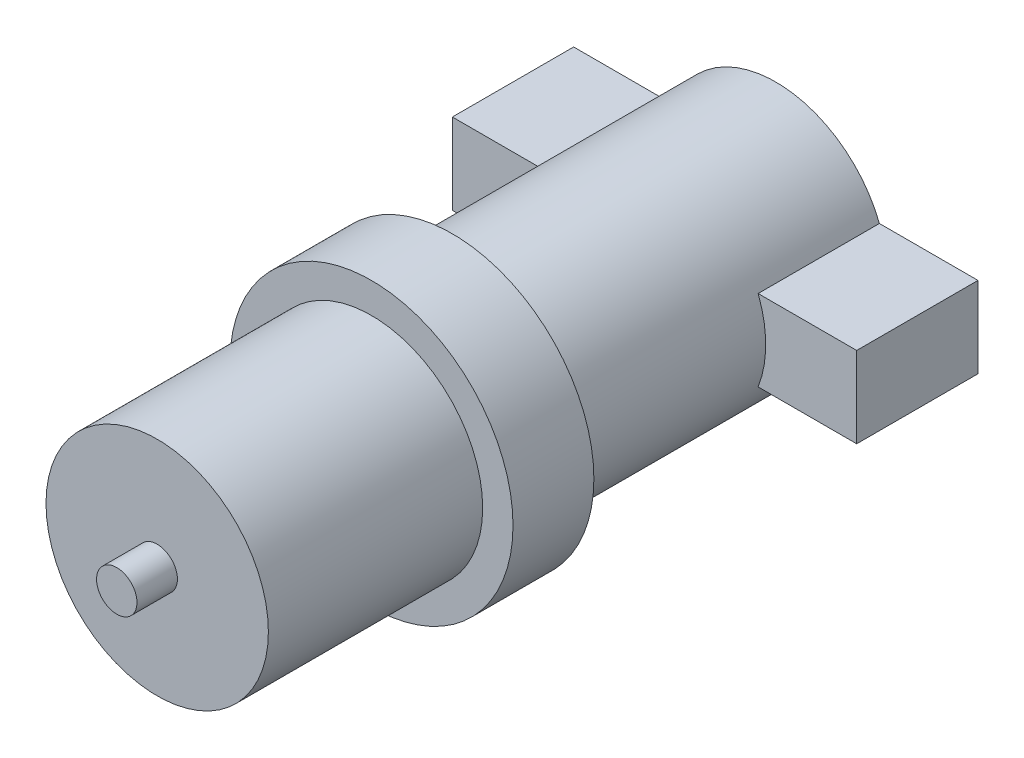
ISO-10303-21;
HEADER;
FILE_DESCRIPTION(('STEP AP214'),'2;1');
FILE_NAME('part.step','',(''),(''),'','','');
FILE_SCHEMA(('AUTOMOTIVE_DESIGN { 1 0 10303 214 1 1 1 1 }'));
ENDSEC;
DATA;
#1=APPLICATION_CONTEXT('core data for automotive mechanical design processes');
#2=APPLICATION_PROTOCOL_DEFINITION('international standard','automotive_design',2000,#1);
#3=PRODUCT_CONTEXT('',#1,'mechanical');
#4=PRODUCT('Part','Part','',(#3));
#5=PRODUCT_RELATED_PRODUCT_CATEGORY('part','',(#4));
#6=PRODUCT_DEFINITION_FORMATION('','',#4);
#7=PRODUCT_DEFINITION_CONTEXT('part definition',#1,'design');
#8=PRODUCT_DEFINITION('design','',#6,#7);
#9=PRODUCT_DEFINITION_SHAPE('','',#8);
#10=(LENGTH_UNIT() NAMED_UNIT(*) SI_UNIT(.MILLI.,.METRE.));
#11=(NAMED_UNIT(*) PLANE_ANGLE_UNIT() SI_UNIT($,.RADIAN.));
#12=(NAMED_UNIT(*) SI_UNIT($,.STERADIAN.) SOLID_ANGLE_UNIT());
#13=UNCERTAINTY_MEASURE_WITH_UNIT(LENGTH_MEASURE(1.E-05),#10,'distance_accuracy_value','');
#14=(GEOMETRIC_REPRESENTATION_CONTEXT(3) GLOBAL_UNCERTAINTY_ASSIGNED_CONTEXT((#13)) GLOBAL_UNIT_ASSIGNED_CONTEXT((#10,
#11,#12)) REPRESENTATION_CONTEXT('',''));
#15=CARTESIAN_POINT('',(0.,0.,0.));
#16=DIRECTION('',(0.,0.,1.));
#17=DIRECTION('',(1.,0.,0.));
#18=AXIS2_PLACEMENT_3D('',#15,#16,#17);
#19=CARTESIAN_POINT('',(0.,0.,30.));
#20=DIRECTION('',(0.,0.,-1.));
#21=DIRECTION('',(-1.,0.,0.));
#22=AXIS2_PLACEMENT_3D('',#19,#20,#21);
#23=CYLINDRICAL_SURFACE('',#22,27.5);
#24=CARTESIAN_POINT('',(0.,0.,-20.));
#25=DIRECTION('',(0.,0.,1.));
#26=DIRECTION('',(1.,0.,0.));
#27=AXIS2_PLACEMENT_3D('',#24,#25,#26);
#28=CIRCLE('',#27,27.5);
#29=CARTESIAN_POINT('',(-25.617376914899,10.,-20.));
#30=VERTEX_POINT('',#29);
#31=CARTESIAN_POINT('',(-25.617376914899,-10.,-20.));
#32=VERTEX_POINT('',#31);
#33=EDGE_CURVE('E11',#30,#32,#28,.T.);
#34=ORIENTED_EDGE('',*,*,#33,.T.);
#35=DIRECTION('',(0.,0.,-1.));
#36=VECTOR('',#35,1.);
#37=CARTESIAN_POINT('',(-25.617376914899,-10.,30.));
#38=LINE('',#37,#36);
#39=CARTESIAN_POINT('',(-25.617376914899,-10.,-50.));
#40=VERTEX_POINT('',#39);
#41=EDGE_CURVE('E150',#32,#40,#38,.T.);
#42=ORIENTED_EDGE('',*,*,#41,.T.);
#43=CARTESIAN_POINT('',(0.,0.,-50.));
#44=DIRECTION('',(0.,0.,-1.));
#45=DIRECTION('',(-1.,0.,0.));
#46=AXIS2_PLACEMENT_3D('',#43,#44,#45);
#47=CIRCLE('',#46,27.5);
#48=CARTESIAN_POINT('',(25.617376914899,-10.,-50.));
#49=VERTEX_POINT('',#48);
#50=EDGE_CURVE('E153',#49,#40,#47,.T.);
#51=ORIENTED_EDGE('',*,*,#50,.F.);
#52=DIRECTION('',(0.,0.,-1.));
#53=VECTOR('',#52,1.);
#54=CARTESIAN_POINT('',(25.617376914899,-10.,30.));
#55=LINE('',#54,#53);
#56=CARTESIAN_POINT('',(25.617376914899,-10.,-20.));
#57=VERTEX_POINT('',#56);
#58=EDGE_CURVE('E147',#49,#57,#55,.F.);
#59=ORIENTED_EDGE('',*,*,#58,.T.);
#60=CARTESIAN_POINT('',(25.617376914899,10.,-20.));
#61=VERTEX_POINT('',#60);
#62=EDGE_CURVE('E36',#57,#61,#28,.T.);
#63=ORIENTED_EDGE('',*,*,#62,.T.);
#64=DIRECTION('',(0.,0.,-1.));
#65=VECTOR('',#64,1.);
#66=CARTESIAN_POINT('',(25.617376914899,10.,30.));
#67=LINE('',#66,#65);
#68=CARTESIAN_POINT('',(25.617376914899,10.,-50.));
#69=VERTEX_POINT('',#68);
#70=EDGE_CURVE('E144',#61,#69,#67,.T.);
#71=ORIENTED_EDGE('',*,*,#70,.T.);
#72=CARTESIAN_POINT('',(-25.617376914899,10.,-50.));
#73=VERTEX_POINT('',#72);
#74=EDGE_CURVE('E154',#73,#69,#47,.T.);
#75=ORIENTED_EDGE('',*,*,#74,.F.);
#76=DIRECTION('',(0.,0.,-1.));
#77=VECTOR('',#76,1.);
#78=CARTESIAN_POINT('',(-25.617376914899,10.,30.));
#79=LINE('',#78,#77);
#80=EDGE_CURVE('E138',#73,#30,#79,.F.);
#81=ORIENTED_EDGE('',*,*,#80,.T.);
#82=EDGE_LOOP('',(#34,#42,#51,#59,#63,#71,#75,#81));
#83=FACE_BOUND('',#82,.T.);
#84=CARTESIAN_POINT('',(0.,0.,30.));
#85=DIRECTION('',(0.,0.,1.));
#86=DIRECTION('',(1.,0.,0.));
#87=AXIS2_PLACEMENT_3D('',#84,#85,#86);
#88=CIRCLE('',#87,27.5);
#89=CARTESIAN_POINT('',(27.5,0.,30.));
#90=VERTEX_POINT('',#89);
#91=EDGE_CURVE('E169',#90,#90,#88,.T.);
#92=ORIENTED_EDGE('',*,*,#91,.F.);
#93=EDGE_LOOP('',(#92));
#94=FACE_BOUND('',#93,.T.);
#95=ADVANCED_FACE('F33',(#83,#94),#23,.T.);
#96=CARTESIAN_POINT('',(0.,0.,50.));
#97=DIRECTION('',(0.,0.,-1.));
#98=DIRECTION('',(-1.,0.,0.));
#99=AXIS2_PLACEMENT_3D('',#96,#97,#98);
#100=CYLINDRICAL_SURFACE('',#99,35.);
#101=CARTESIAN_POINT('',(0.,0.,50.));
#102=DIRECTION('',(0.,0.,1.));
#103=DIRECTION('',(1.,0.,0.));
#104=AXIS2_PLACEMENT_3D('',#101,#102,#103);
#105=CIRCLE('',#104,35.);
#106=CARTESIAN_POINT('',(35.,0.,50.));
#107=VERTEX_POINT('',#106);
#108=EDGE_CURVE('E170',#107,#107,#105,.T.);
#109=ORIENTED_EDGE('',*,*,#108,.F.);
#110=EDGE_LOOP('',(#109));
#111=FACE_BOUND('',#110,.T.);
#112=CARTESIAN_POINT('',(0.,0.,30.));
#113=DIRECTION('',(0.,0.,1.));
#114=DIRECTION('',(1.,0.,0.));
#115=AXIS2_PLACEMENT_3D('',#112,#113,#114);
#116=CIRCLE('',#115,35.);
#117=CARTESIAN_POINT('',(35.,0.,30.));
#118=VERTEX_POINT('',#117);
#119=EDGE_CURVE('E166',#118,#118,#116,.T.);
#120=ORIENTED_EDGE('',*,*,#119,.T.);
#121=EDGE_LOOP('',(#120));
#122=FACE_BOUND('',#121,.T.);
#123=ADVANCED_FACE('F181',(#111,#122),#100,.T.);
#124=CARTESIAN_POINT('',(0.,0.,50.));
#125=DIRECTION('',(0.,0.,1.));
#126=DIRECTION('',(1.,0.,0.));
#127=AXIS2_PLACEMENT_3D('',#124,#125,#126);
#128=PLANE('',#127);
#129=CARTESIAN_POINT('',(0.,0.,50.));
#130=DIRECTION('',(0.,0.,1.));
#131=DIRECTION('',(1.,0.,0.));
#132=AXIS2_PLACEMENT_3D('',#129,#130,#131);
#133=CIRCLE('',#132,27.5);
#134=CARTESIAN_POINT('',(27.5,0.,50.));
#135=VERTEX_POINT('',#134);
#136=EDGE_CURVE('E163',#135,#135,#133,.T.);
#137=ORIENTED_EDGE('',*,*,#136,.F.);
#138=EDGE_LOOP('',(#137));
#139=FACE_BOUND('',#138,.T.);
#140=ORIENTED_EDGE('',*,*,#108,.T.);
#141=EDGE_LOOP('',(#140));
#142=FACE_BOUND('',#141,.T.);
#143=ADVANCED_FACE('F186',(#139,#142),#128,.T.);
#144=CARTESIAN_POINT('',(0.,0.,30.));
#145=DIRECTION('',(0.,0.,1.));
#146=DIRECTION('',(1.,0.,0.));
#147=AXIS2_PLACEMENT_3D('',#144,#145,#146);
#148=PLANE('',#147);
#149=ORIENTED_EDGE('',*,*,#91,.T.);
#150=EDGE_LOOP('',(#149));
#151=FACE_BOUND('',#150,.T.);
#152=ORIENTED_EDGE('',*,*,#119,.F.);
#153=EDGE_LOOP('',(#152));
#154=FACE_BOUND('',#153,.T.);
#155=ADVANCED_FACE('F177',(#151,#154),#148,.F.);
#156=CARTESIAN_POINT('',(0.,0.,103.));
#157=DIRECTION('',(0.,0.,-1.));
#158=DIRECTION('',(-1.,0.,0.));
#159=AXIS2_PLACEMENT_3D('',#156,#157,#158);
#160=CYLINDRICAL_SURFACE('',#159,27.5);
#161=CARTESIAN_POINT('',(0.,0.,103.));
#162=DIRECTION('',(0.,0.,1.));
#163=DIRECTION('',(1.,0.,0.));
#164=AXIS2_PLACEMENT_3D('',#161,#162,#163);
#165=CIRCLE('',#164,27.5);
#166=CARTESIAN_POINT('',(27.5,0.,103.));
#167=VERTEX_POINT('',#166);
#168=EDGE_CURVE('E159',#167,#167,#165,.T.);
#169=ORIENTED_EDGE('',*,*,#168,.F.);
#170=EDGE_LOOP('',(#169));
#171=FACE_BOUND('',#170,.T.);
#172=ORIENTED_EDGE('',*,*,#136,.T.);
#173=EDGE_LOOP('',(#172));
#174=FACE_BOUND('',#173,.T.);
#175=ADVANCED_FACE('F239',(#171,#174),#160,.T.);
#176=CARTESIAN_POINT('',(0.,0.,103.));
#177=DIRECTION('',(0.,0.,1.));
#178=DIRECTION('',(1.,0.,0.));
#179=AXIS2_PLACEMENT_3D('',#176,#177,#178);
#180=PLANE('',#179);
#181=CARTESIAN_POINT('',(0.,0.,103.));
#182=DIRECTION('',(0.,0.,1.));
#183=DIRECTION('',(1.,0.,0.));
#184=AXIS2_PLACEMENT_3D('',#181,#182,#183);
#185=CIRCLE('',#184,5.);
#186=CARTESIAN_POINT('',(5.,0.,103.));
#187=VERTEX_POINT('',#186);
#188=EDGE_CURVE('E160',#187,#187,#185,.T.);
#189=ORIENTED_EDGE('',*,*,#188,.F.);
#190=EDGE_LOOP('',(#189));
#191=FACE_BOUND('',#190,.T.);
#192=ORIENTED_EDGE('',*,*,#168,.T.);
#193=EDGE_LOOP('',(#192));
#194=FACE_BOUND('',#193,.T.);
#195=ADVANCED_FACE('F235',(#191,#194),#180,.T.);
#196=CARTESIAN_POINT('',(0.,0.,113.));
#197=DIRECTION('',(0.,0.,-1.));
#198=DIRECTION('',(-1.,0.,0.));
#199=AXIS2_PLACEMENT_3D('',#196,#197,#198);
#200=CYLINDRICAL_SURFACE('',#199,5.);
#201=CARTESIAN_POINT('',(0.,0.,113.));
#202=DIRECTION('',(0.,0.,1.));
#203=DIRECTION('',(1.,0.,0.));
#204=AXIS2_PLACEMENT_3D('',#201,#202,#203);
#205=CIRCLE('',#204,5.);
#206=CARTESIAN_POINT('',(5.,0.,113.));
#207=VERTEX_POINT('',#206);
#208=EDGE_CURVE('E156',#207,#207,#205,.T.);
#209=ORIENTED_EDGE('',*,*,#208,.F.);
#210=EDGE_LOOP('',(#209));
#211=FACE_BOUND('',#210,.T.);
#212=ORIENTED_EDGE('',*,*,#188,.T.);
#213=EDGE_LOOP('',(#212));
#214=FACE_BOUND('',#213,.T.);
#215=ADVANCED_FACE('F231',(#211,#214),#200,.T.);
#216=CARTESIAN_POINT('',(0.,0.,113.));
#217=DIRECTION('',(0.,0.,1.));
#218=DIRECTION('',(1.,0.,0.));
#219=AXIS2_PLACEMENT_3D('',#216,#217,#218);
#220=PLANE('',#219);
#221=ORIENTED_EDGE('',*,*,#208,.T.);
#222=EDGE_LOOP('',(#221));
#223=FACE_BOUND('',#222,.T.);
#224=ADVANCED_FACE('F228',(#223),#220,.T.);
#225=CARTESIAN_POINT('',(0.,0.,-50.));
#226=DIRECTION('',(0.,0.,-1.));
#227=DIRECTION('',(-1.,0.,0.));
#228=AXIS2_PLACEMENT_3D('',#225,#226,#227);
#229=PLANE('',#228);
#230=ORIENTED_EDGE('',*,*,#74,.T.);
#231=DIRECTION('',(1.,0.,0.));
#232=VECTOR('',#231,1.);
#233=CARTESIAN_POINT('',(50.,10.,-50.));
#234=LINE('',#233,#232);
#235=CARTESIAN_POINT('',(50.,10.,-50.));
#236=VERTEX_POINT('',#235);
#237=EDGE_CURVE('E133',#69,#236,#234,.T.);
#238=ORIENTED_EDGE('',*,*,#237,.T.);
#239=DIRECTION('',(0.,-1.,0.));
#240=VECTOR('',#239,1.);
#241=CARTESIAN_POINT('',(50.,-10.,-50.));
#242=LINE('',#241,#240);
#243=CARTESIAN_POINT('',(50.,-10.,-50.));
#244=VERTEX_POINT('',#243);
#245=EDGE_CURVE('E135',#236,#244,#242,.T.);
#246=ORIENTED_EDGE('',*,*,#245,.T.);
#247=DIRECTION('',(-1.,0.,0.));
#248=VECTOR('',#247,1.);
#249=CARTESIAN_POINT('',(50.,-10.,-50.));
#250=LINE('',#249,#248);
#251=EDGE_CURVE('E47',#244,#49,#250,.T.);
#252=ORIENTED_EDGE('',*,*,#251,.T.);
#253=ORIENTED_EDGE('',*,*,#50,.T.);
#254=CARTESIAN_POINT('',(-50.,-10.,-50.));
#255=VERTEX_POINT('',#254);
#256=EDGE_CURVE('E123',#40,#255,#250,.T.);
#257=ORIENTED_EDGE('',*,*,#256,.T.);
#258=DIRECTION('',(0.,1.,0.));
#259=VECTOR('',#258,1.);
#260=CARTESIAN_POINT('',(-50.,-10.,-50.));
#261=LINE('',#260,#259);
#262=CARTESIAN_POINT('',(-50.,10.,-50.));
#263=VERTEX_POINT('',#262);
#264=EDGE_CURVE('E131',#255,#263,#261,.T.);
#265=ORIENTED_EDGE('',*,*,#264,.T.);
#266=EDGE_CURVE('E54',#263,#73,#234,.T.);
#267=ORIENTED_EDGE('',*,*,#266,.T.);
#268=EDGE_LOOP('',(#230,#238,#246,#252,#253,#257,#265,#267));
#269=FACE_BOUND('',#268,.T.);
#270=ADVANCED_FACE('F191',(#269),#229,.T.);
#271=CARTESIAN_POINT('',(50.,-10.,-20.));
#272=DIRECTION('',(1.,0.,0.));
#273=DIRECTION('',(0.,0.,-1.));
#274=AXIS2_PLACEMENT_3D('',#271,#272,#273);
#275=PLANE('',#274);
#276=ORIENTED_EDGE('',*,*,#245,.F.);
#277=DIRECTION('',(0.,0.,-1.));
#278=VECTOR('',#277,1.);
#279=CARTESIAN_POINT('',(50.,10.,-20.));
#280=LINE('',#279,#278);
#281=CARTESIAN_POINT('',(50.,10.,-20.));
#282=VERTEX_POINT('',#281);
#283=EDGE_CURVE('E107',#282,#236,#280,.T.);
#284=ORIENTED_EDGE('',*,*,#283,.F.);
#285=DIRECTION('',(0.,-1.,0.));
#286=VECTOR('',#285,1.);
#287=CARTESIAN_POINT('',(50.,-10.,-20.));
#288=LINE('',#287,#286);
#289=CARTESIAN_POINT('',(50.,-10.,-20.));
#290=VERTEX_POINT('',#289);
#291=EDGE_CURVE('E115',#282,#290,#288,.T.);
#292=ORIENTED_EDGE('',*,*,#291,.T.);
#293=DIRECTION('',(0.,0.,-1.));
#294=VECTOR('',#293,1.);
#295=CARTESIAN_POINT('',(50.,-10.,-20.));
#296=LINE('',#295,#294);
#297=EDGE_CURVE('E139',#290,#244,#296,.T.);
#298=ORIENTED_EDGE('',*,*,#297,.T.);
#299=EDGE_LOOP('',(#276,#284,#292,#298));
#300=FACE_BOUND('',#299,.T.);
#301=ADVANCED_FACE('F199',(#300),#275,.T.);
#302=CARTESIAN_POINT('',(0.,0.,-20.));
#303=DIRECTION('',(0.,0.,1.));
#304=DIRECTION('',(1.,0.,0.));
#305=AXIS2_PLACEMENT_3D('',#302,#303,#304);
#306=PLANE('',#305);
#307=ORIENTED_EDGE('',*,*,#62,.F.);
#308=DIRECTION('',(-1.,0.,0.));
#309=VECTOR('',#308,1.);
#310=CARTESIAN_POINT('',(50.,-10.,-20.));
#311=LINE('',#310,#309);
#312=EDGE_CURVE('E108',#290,#57,#311,.T.);
#313=ORIENTED_EDGE('',*,*,#312,.F.);
#314=ORIENTED_EDGE('',*,*,#291,.F.);
#315=DIRECTION('',(1.,0.,0.));
#316=VECTOR('',#315,1.);
#317=CARTESIAN_POINT('',(50.,10.,-20.));
#318=LINE('',#317,#316);
#319=EDGE_CURVE('E116',#61,#282,#318,.T.);
#320=ORIENTED_EDGE('',*,*,#319,.F.);
#321=EDGE_LOOP('',(#307,#313,#314,#320));
#322=FACE_BOUND('',#321,.T.);
#323=ADVANCED_FACE('F213',(#322),#306,.T.);
#324=CARTESIAN_POINT('',(50.,10.,-20.));
#325=DIRECTION('',(0.,1.,0.));
#326=DIRECTION('',(0.,0.,1.));
#327=AXIS2_PLACEMENT_3D('',#324,#325,#326);
#328=PLANE('',#327);
#329=ORIENTED_EDGE('',*,*,#70,.F.);
#330=ORIENTED_EDGE('',*,*,#319,.T.);
#331=ORIENTED_EDGE('',*,*,#283,.T.);
#332=ORIENTED_EDGE('',*,*,#237,.F.);
#333=EDGE_LOOP('',(#329,#330,#331,#332));
#334=FACE_BOUND('',#333,.T.);
#335=ADVANCED_FACE('F195',(#334),#328,.T.);
#336=CARTESIAN_POINT('',(50.,-10.,-20.));
#337=DIRECTION('',(0.,-1.,0.));
#338=DIRECTION('',(0.,0.,-1.));
#339=AXIS2_PLACEMENT_3D('',#336,#337,#338);
#340=PLANE('',#339);
#341=ORIENTED_EDGE('',*,*,#58,.F.);
#342=ORIENTED_EDGE('',*,*,#251,.F.);
#343=ORIENTED_EDGE('',*,*,#297,.F.);
#344=ORIENTED_EDGE('',*,*,#312,.T.);
#345=EDGE_LOOP('',(#341,#342,#343,#344));
#346=FACE_BOUND('',#345,.T.);
#347=ADVANCED_FACE('F202',(#346),#340,.T.);
#348=ORIENTED_EDGE('',*,*,#33,.F.);
#349=CARTESIAN_POINT('',(-50.,10.,-20.));
#350=VERTEX_POINT('',#349);
#351=EDGE_CURVE('E102',#350,#30,#318,.T.);
#352=ORIENTED_EDGE('',*,*,#351,.F.);
#353=DIRECTION('',(0.,1.,0.));
#354=VECTOR('',#353,1.);
#355=CARTESIAN_POINT('',(-50.,-10.,-20.));
#356=LINE('',#355,#354);
#357=CARTESIAN_POINT('',(-50.,-10.,-20.));
#358=VERTEX_POINT('',#357);
#359=EDGE_CURVE('E114',#358,#350,#356,.T.);
#360=ORIENTED_EDGE('',*,*,#359,.F.);
#361=EDGE_CURVE('E128',#32,#358,#311,.T.);
#362=ORIENTED_EDGE('',*,*,#361,.F.);
#363=EDGE_LOOP('',(#348,#352,#360,#362));
#364=FACE_BOUND('',#363,.T.);
#365=ADVANCED_FACE('F112',(#364),#306,.T.);
#366=ORIENTED_EDGE('',*,*,#41,.F.);
#367=ORIENTED_EDGE('',*,*,#361,.T.);
#368=DIRECTION('',(0.,0.,-1.));
#369=VECTOR('',#368,1.);
#370=CARTESIAN_POINT('',(-50.,-10.,-20.));
#371=LINE('',#370,#369);
#372=EDGE_CURVE('E121',#358,#255,#371,.T.);
#373=ORIENTED_EDGE('',*,*,#372,.T.);
#374=ORIENTED_EDGE('',*,*,#256,.F.);
#375=EDGE_LOOP('',(#366,#367,#373,#374));
#376=FACE_BOUND('',#375,.T.);
#377=ADVANCED_FACE('F204',(#376),#340,.T.);
#378=ORIENTED_EDGE('',*,*,#80,.F.);
#379=ORIENTED_EDGE('',*,*,#266,.F.);
#380=DIRECTION('',(0.,0.,-1.));
#381=VECTOR('',#380,1.);
#382=CARTESIAN_POINT('',(-50.,10.,-20.));
#383=LINE('',#382,#381);
#384=EDGE_CURVE('E99',#350,#263,#383,.T.);
#385=ORIENTED_EDGE('',*,*,#384,.F.);
#386=ORIENTED_EDGE('',*,*,#351,.T.);
#387=EDGE_LOOP('',(#378,#379,#385,#386));
#388=FACE_BOUND('',#387,.T.);
#389=ADVANCED_FACE('F101',(#388),#328,.T.);
#390=CARTESIAN_POINT('',(-50.,-10.,-20.));
#391=DIRECTION('',(-1.,0.,0.));
#392=DIRECTION('',(0.,0.,1.));
#393=AXIS2_PLACEMENT_3D('',#390,#391,#392);
#394=PLANE('',#393);
#395=ORIENTED_EDGE('',*,*,#264,.F.);
#396=ORIENTED_EDGE('',*,*,#372,.F.);
#397=ORIENTED_EDGE('',*,*,#359,.T.);
#398=ORIENTED_EDGE('',*,*,#384,.T.);
#399=EDGE_LOOP('',(#395,#396,#397,#398));
#400=FACE_BOUND('',#399,.T.);
#401=ADVANCED_FACE('F119',(#400),#394,.T.);
#402=CLOSED_SHELL('',(#95,#123,#143,#155,#175,#195,#215,#224,#270,#301,#323,#335,#347,#365,#377,
#389,#401));
#403=MANIFOLD_SOLID_BREP('B2',#402);
#404=ADVANCED_BREP_SHAPE_REPRESENTATION('',(#18,#403),#14);
#405=SHAPE_DEFINITION_REPRESENTATION(#9,#404);
ENDSEC;
END-ISO-10303-21;
